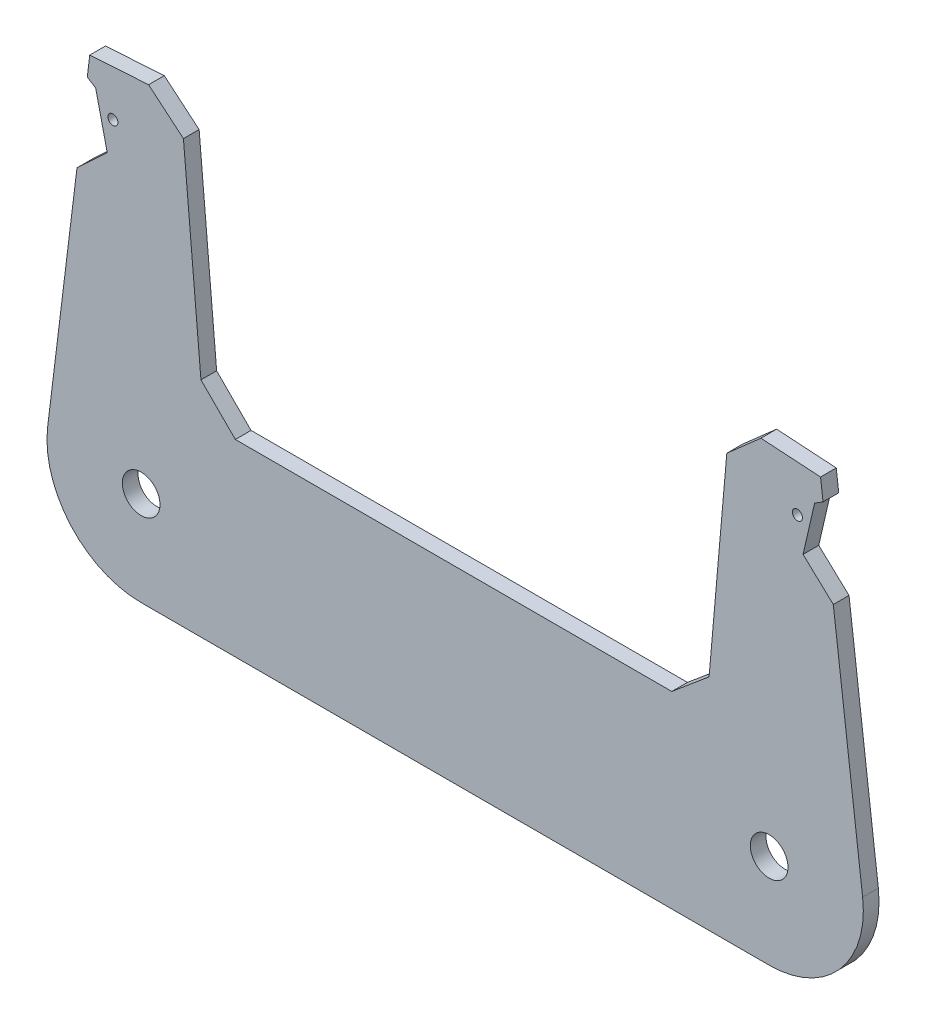
ISO-10303-21;
HEADER;
FILE_DESCRIPTION(('STEP AP214'),'2;1');
FILE_NAME('part.step','',(''),(''),'','','');
FILE_SCHEMA(('AUTOMOTIVE_DESIGN { 1 0 10303 214 1 1 1 1 }'));
ENDSEC;
DATA;
#1=APPLICATION_CONTEXT('core data for automotive mechanical design processes');
#2=APPLICATION_PROTOCOL_DEFINITION('international standard','automotive_design',2000,#1);
#3=PRODUCT_CONTEXT('',#1,'mechanical');
#4=PRODUCT('Part','Part','',(#3));
#5=PRODUCT_RELATED_PRODUCT_CATEGORY('part','',(#4));
#6=PRODUCT_DEFINITION_FORMATION('','',#4);
#7=PRODUCT_DEFINITION_CONTEXT('part definition',#1,'design');
#8=PRODUCT_DEFINITION('design','',#6,#7);
#9=PRODUCT_DEFINITION_SHAPE('','',#8);
#10=(LENGTH_UNIT() NAMED_UNIT(*) SI_UNIT(.MILLI.,.METRE.));
#11=(NAMED_UNIT(*) PLANE_ANGLE_UNIT() SI_UNIT($,.RADIAN.));
#12=(NAMED_UNIT(*) SI_UNIT($,.STERADIAN.) SOLID_ANGLE_UNIT());
#13=UNCERTAINTY_MEASURE_WITH_UNIT(LENGTH_MEASURE(1.E-05),#10,'distance_accuracy_value','');
#14=(GEOMETRIC_REPRESENTATION_CONTEXT(3) GLOBAL_UNCERTAINTY_ASSIGNED_CONTEXT((#13)) GLOBAL_UNIT_ASSIGNED_CONTEXT((#10,
#11,#12)) REPRESENTATION_CONTEXT('',''));
#15=CARTESIAN_POINT('',(0.,0.,0.));
#16=DIRECTION('',(0.,0.,1.));
#17=DIRECTION('',(1.,0.,0.));
#18=AXIS2_PLACEMENT_3D('',#15,#16,#17);
#19=CARTESIAN_POINT('',(-116.370756774674,112.8361569827,5.));
#20=DIRECTION('',(0.992546151641323,-0.121869343405144,0.));
#21=DIRECTION('',(0.121869343405144,0.992546151641323,0.));
#22=AXIS2_PLACEMENT_3D('',#19,#20,#21);
#23=PLANE('',#22);
#24=DIRECTION('',(-0.121869343405144,-0.992546151641323,0.));
#25=VECTOR('',#24,1.);
#26=CARTESIAN_POINT('',(-116.370756774674,112.8361569827,5.));
#27=LINE('',#26,#25);
#28=CARTESIAN_POINT('',(-120.438781702683,79.7047526913547,5.));
#29=VERTEX_POINT('',#28);
#30=CARTESIAN_POINT('',(-129.77638454924,3.65608030215437,5.));
#31=VERTEX_POINT('',#30);
#32=EDGE_CURVE('E246',#29,#31,#27,.T.);
#33=ORIENTED_EDGE('',*,*,#32,.F.);
#34=DIRECTION('',(0.,0.,-1.));
#35=VECTOR('',#34,1.);
#36=CARTESIAN_POINT('',(-120.438781702683,79.7047526913547,5.));
#37=LINE('',#36,#35);
#38=CARTESIAN_POINT('',(-120.438781702683,79.7047526913547,0.));
#39=VERTEX_POINT('',#38);
#40=EDGE_CURVE('E198',#29,#39,#37,.T.);
#41=ORIENTED_EDGE('',*,*,#40,.T.);
#42=DIRECTION('',(-0.121869343405144,-0.992546151641323,0.));
#43=VECTOR('',#42,1.);
#44=CARTESIAN_POINT('',(-116.370756774674,112.8361569827,0.));
#45=LINE('',#44,#43);
#46=CARTESIAN_POINT('',(-129.77638454924,3.65608030215437,0.));
#47=VERTEX_POINT('',#46);
#48=EDGE_CURVE('E217',#39,#47,#45,.T.);
#49=ORIENTED_EDGE('',*,*,#48,.T.);
#50=DIRECTION('',(0.,0.,-1.));
#51=VECTOR('',#50,1.);
#52=CARTESIAN_POINT('',(-129.77638454924,3.65608030215437,5.));
#53=LINE('',#52,#51);
#54=EDGE_CURVE('E260',#31,#47,#53,.T.);
#55=ORIENTED_EDGE('',*,*,#54,.F.);
#56=EDGE_LOOP('',(#33,#41,#49,#55));
#57=FACE_BOUND('',#56,.T.);
#58=ADVANCED_FACE('F38',(#57),#23,.F.);
#59=CARTESIAN_POINT('',(116.370756774674,112.8361569827,5.));
#60=DIRECTION('',(-0.992546151641323,-0.121869343405144,0.));
#61=DIRECTION('',(0.121869343405144,-0.992546151641323,0.));
#62=AXIS2_PLACEMENT_3D('',#59,#60,#61);
#63=PLANE('',#62);
#64=DIRECTION('',(-0.121869343405144,0.992546151641323,0.));
#65=VECTOR('',#64,1.);
#66=CARTESIAN_POINT('',(116.370756774674,112.8361569827,5.));
#67=LINE('',#66,#65);
#68=CARTESIAN_POINT('',(117.165001341998,106.367554077879,5.));
#69=VERTEX_POINT('',#68);
#70=CARTESIAN_POINT('',(116.370756774674,112.8361569827,5.));
#71=VERTEX_POINT('',#70);
#72=EDGE_CURVE('E325',#69,#71,#67,.T.);
#73=ORIENTED_EDGE('',*,*,#72,.F.);
#74=DIRECTION('',(0.,0.,-1.));
#75=VECTOR('',#74,1.);
#76=CARTESIAN_POINT('',(117.165001341998,106.367554077879,5.));
#77=LINE('',#76,#75);
#78=CARTESIAN_POINT('',(117.165001341998,106.367554077879,0.));
#79=VERTEX_POINT('',#78);
#80=EDGE_CURVE('E199',#69,#79,#77,.T.);
#81=ORIENTED_EDGE('',*,*,#80,.T.);
#82=DIRECTION('',(-0.121869343405144,0.992546151641323,0.));
#83=VECTOR('',#82,1.);
#84=CARTESIAN_POINT('',(116.370756774674,112.8361569827,0.));
#85=LINE('',#84,#83);
#86=CARTESIAN_POINT('',(116.370756774674,112.8361569827,0.));
#87=VERTEX_POINT('',#86);
#88=EDGE_CURVE('E229',#79,#87,#85,.T.);
#89=ORIENTED_EDGE('',*,*,#88,.T.);
#90=DIRECTION('',(0.,0.,-1.));
#91=VECTOR('',#90,1.);
#92=CARTESIAN_POINT('',(116.370756774674,112.8361569827,5.));
#93=LINE('',#92,#91);
#94=EDGE_CURVE('E248',#71,#87,#93,.T.);
#95=ORIENTED_EDGE('',*,*,#94,.F.);
#96=EDGE_LOOP('',(#73,#81,#89,#95));
#97=FACE_BOUND('',#96,.T.);
#98=ADVANCED_FACE('F434',(#97),#63,.F.);
#99=CARTESIAN_POINT('',(-100.,0.,5.));
#100=DIRECTION('',(0.,0.,-1.));
#101=DIRECTION('',(-1.,0.,0.));
#102=AXIS2_PLACEMENT_3D('',#99,#100,#101);
#103=PLANE('',#102);
#104=CARTESIAN_POINT('',(109.,98.6962936535525,5.));
#105=DIRECTION('',(0.,0.,-1.));
#106=DIRECTION('',(-1.,0.,0.));
#107=AXIS2_PLACEMENT_3D('',#104,#105,#106);
#108=CIRCLE('',#107,1.59999999999998);
#109=CARTESIAN_POINT('',(107.4,98.6962936535525,5.));
#110=VERTEX_POINT('',#109);
#111=EDGE_CURVE('E348',#110,#110,#108,.T.);
#112=ORIENTED_EDGE('',*,*,#111,.T.);
#113=EDGE_LOOP('',(#112));
#114=FACE_BOUND('',#113,.T.);
#115=CARTESIAN_POINT('',(-109.,98.696293653552,5.));
#116=DIRECTION('',(0.,0.,-1.));
#117=DIRECTION('',(-1.,0.,0.));
#118=AXIS2_PLACEMENT_3D('',#115,#116,#117);
#119=CIRCLE('',#118,1.60000000000001);
#120=CARTESIAN_POINT('',(-110.6,98.696293653552,5.));
#121=VERTEX_POINT('',#120);
#122=EDGE_CURVE('E354',#121,#121,#119,.T.);
#123=ORIENTED_EDGE('',*,*,#122,.T.);
#124=EDGE_LOOP('',(#123));
#125=FACE_BOUND('',#124,.T.);
#126=DIRECTION('',(-1.,0.,0.));
#127=VECTOR('',#126,1.);
#128=CARTESIAN_POINT('',(80.,30.0000000000001,5.));
#129=LINE('',#128,#127);
#130=CARTESIAN_POINT('',(68.999371323735,30.0000000000001,5.));
#131=VERTEX_POINT('',#130);
#132=CARTESIAN_POINT('',(-70.,30.0000000000001,5.));
#133=VERTEX_POINT('',#132);
#134=EDGE_CURVE('E313',#131,#133,#129,.T.);
#135=ORIENTED_EDGE('',*,*,#134,.T.);
#136=DIRECTION('',(0.707106781186543,-0.707106781186553,0.));
#137=VECTOR('',#136,1.);
#138=CARTESIAN_POINT('',(-69.9999999999998,29.9999999999998,5.));
#139=LINE('',#138,#137);
#140=CARTESIAN_POINT('',(-80.9587679629711,40.9587679629713,5.));
#141=VERTEX_POINT('',#140);
#142=EDGE_CURVE('E11',#133,#141,#139,.F.);
#143=ORIENTED_EDGE('',*,*,#142,.T.);
#144=DIRECTION('',(-0.0871557427476619,0.996194698091745,0.));
#145=VECTOR('',#144,1.);
#146=CARTESIAN_POINT('',(-87.4082381335513,114.676549337798,5.));
#147=LINE('',#146,#145);
#148=CARTESIAN_POINT('',(-86.5366807060746,104.714602356881,5.));
#149=VERTEX_POINT('',#148);
#150=EDGE_CURVE('E310',#141,#149,#147,.T.);
#151=ORIENTED_EDGE('',*,*,#150,.T.);
#152=DIRECTION('',(0.766044443118979,-0.642787609686538,0.));
#153=VECTOR('',#152,1.);
#154=CARTESIAN_POINT('',(-97.6344490404908,114.02673567318,5.));
#155=LINE('',#154,#153);
#156=CARTESIAN_POINT('',(-97.6344490404908,114.02673567318,5.));
#157=VERTEX_POINT('',#156);
#158=EDGE_CURVE('E283',#149,#157,#155,.F.);
#159=ORIENTED_EDGE('',*,*,#158,.T.);
#160=DIRECTION('',(-0.997987177795872,-0.0634160307416799,0.));
#161=VECTOR('',#160,1.);
#162=CARTESIAN_POINT('',(-116.370756774674,112.8361569827,5.));
#163=LINE('',#162,#161);
#164=CARTESIAN_POINT('',(-116.370756774674,112.8361569827,5.));
#165=VERTEX_POINT('',#164);
#166=EDGE_CURVE('E223',#157,#165,#163,.T.);
#167=ORIENTED_EDGE('',*,*,#166,.T.);
#168=CARTESIAN_POINT('',(-117.165001341998,106.367554077879,5.));
#169=VERTEX_POINT('',#168);
#170=EDGE_CURVE('E332',#165,#169,#27,.T.);
#171=ORIENTED_EDGE('',*,*,#170,.T.);
#172=DIRECTION('',(0.848048096156423,-0.529919264233209,0.));
#173=VECTOR('',#172,1.);
#174=CARTESIAN_POINT('',(-57.0189178472336,68.7841098646213,5.));
#175=LINE('',#174,#173);
#176=CARTESIAN_POINT('',(-114.490425577927,104.696293653552,5.));
#177=VERTEX_POINT('',#176);
#178=EDGE_CURVE('E193',#169,#177,#175,.T.);
#179=ORIENTED_EDGE('',*,*,#178,.T.);
#180=DIRECTION('',(0.224951054343871,-0.974370064785234,0.));
#181=VECTOR('',#180,1.);
#182=CARTESIAN_POINT('',(-90.809249751117,2.12185188504653,5.));
#183=LINE('',#182,#181);
#184=CARTESIAN_POINT('',(-110.796534519918,88.6962936535519,5.));
#185=VERTEX_POINT('',#184);
#186=EDGE_CURVE('E351',#177,#185,#183,.T.);
#187=ORIENTED_EDGE('',*,*,#186,.T.);
#188=DIRECTION('',(-0.731353701619163,-0.681998360062506,0.));
#189=VECTOR('',#188,1.);
#190=CARTESIAN_POINT('',(-149.261820141612,52.8268345187273,5.));
#191=LINE('',#190,#189);
#192=EDGE_CURVE('E357',#185,#29,#191,.T.);
#193=ORIENTED_EDGE('',*,*,#192,.T.);
#194=ORIENTED_EDGE('',*,*,#32,.T.);
#195=CARTESIAN_POINT('',(-100.,0.,5.));
#196=DIRECTION('',(0.,0.,1.));
#197=DIRECTION('',(-1.,0.,0.));
#198=AXIS2_PLACEMENT_3D('',#195,#196,#197);
#199=CIRCLE('',#198,30.);
#200=CARTESIAN_POINT('',(-100.,-30.,5.));
#201=VERTEX_POINT('',#200);
#202=EDGE_CURVE('E330',#31,#201,#199,.T.);
#203=ORIENTED_EDGE('',*,*,#202,.T.);
#204=DIRECTION('',(1.,0.,0.));
#205=VECTOR('',#204,1.);
#206=CARTESIAN_POINT('',(-100.,-30.,5.));
#207=LINE('',#206,#205);
#208=CARTESIAN_POINT('',(100.,-30.,5.));
#209=VERTEX_POINT('',#208);
#210=EDGE_CURVE('E328',#201,#209,#207,.T.);
#211=ORIENTED_EDGE('',*,*,#210,.T.);
#212=CARTESIAN_POINT('',(100.,0.,5.));
#213=DIRECTION('',(0.,0.,1.));
#214=DIRECTION('',(1.,0.,0.));
#215=AXIS2_PLACEMENT_3D('',#212,#213,#214);
#216=CIRCLE('',#215,30.);
#217=CARTESIAN_POINT('',(129.77638454924,3.65608030215436,5.));
#218=VERTEX_POINT('',#217);
#219=EDGE_CURVE('E326',#209,#218,#216,.T.);
#220=ORIENTED_EDGE('',*,*,#219,.T.);
#221=CARTESIAN_POINT('',(120.438781702683,79.7047526913547,5.));
#222=VERTEX_POINT('',#221);
#223=EDGE_CURVE('E322',#218,#222,#67,.T.);
#224=ORIENTED_EDGE('',*,*,#223,.T.);
#225=DIRECTION('',(-0.731353701619163,0.681998360062506,0.));
#226=VECTOR('',#225,1.);
#227=CARTESIAN_POINT('',(42.2861727672015,152.58323954471,5.));
#228=LINE('',#227,#226);
#229=CARTESIAN_POINT('',(110.796534519918,88.6962936535519,5.));
#230=VERTEX_POINT('',#229);
#231=EDGE_CURVE('E364',#222,#230,#228,.T.);
#232=ORIENTED_EDGE('',*,*,#231,.T.);
#233=DIRECTION('',(0.224951054343871,0.974370064785234,0.));
#234=VECTOR('',#233,1.);
#235=CARTESIAN_POINT('',(80.6886543810331,-41.7152627938624,5.));
#236=LINE('',#235,#234);
#237=CARTESIAN_POINT('',(114.490425577927,104.696293653552,5.));
#238=VERTEX_POINT('',#237);
#239=EDGE_CURVE('E343',#230,#238,#236,.T.);
#240=ORIENTED_EDGE('',*,*,#239,.T.);
#241=DIRECTION('',(0.848048096156425,0.529919264233207,0.));
#242=VECTOR('',#241,1.);
#243=CARTESIAN_POINT('',(-86.8181968316735,-21.0952947652954,5.));
#244=LINE('',#243,#242);
#245=EDGE_CURVE('E361',#238,#69,#244,.T.);
#246=ORIENTED_EDGE('',*,*,#245,.T.);
#247=ORIENTED_EDGE('',*,*,#72,.T.);
#248=DIRECTION('',(-0.997987177795872,0.0634160307416799,0.));
#249=VECTOR('',#248,1.);
#250=CARTESIAN_POINT('',(116.370756774674,112.8361569827,5.));
#251=LINE('',#250,#249);
#252=CARTESIAN_POINT('',(97.38810991151,114.042389030382,5.));
#253=VERTEX_POINT('',#252);
#254=EDGE_CURVE('E319',#71,#253,#251,.T.);
#255=ORIENTED_EDGE('',*,*,#254,.T.);
#256=DIRECTION('',(0.750525406330063,0.660841595583309,0.));
#257=VECTOR('',#256,1.);
#258=CARTESIAN_POINT('',(86.5151675341303,104.468705676359,5.));
#259=LINE('',#258,#257);
#260=CARTESIAN_POINT('',(86.5151675341303,104.468705676359,5.));
#261=VERTEX_POINT('',#260);
#262=EDGE_CURVE('E281',#253,#261,#259,.F.);
#263=ORIENTED_EDGE('',*,*,#262,.T.);
#264=DIRECTION('',(-0.0871557427476619,-0.996194698091745,0.));
#265=VECTOR('',#264,1.);
#266=CARTESIAN_POINT('',(87.4082381335513,114.676549337798,5.));
#267=LINE('',#266,#265);
#268=CARTESIAN_POINT('',(80.8715574274766,39.9619469809175,5.));
#269=VERTEX_POINT('',#268);
#270=EDGE_CURVE('E314',#261,#269,#267,.T.);
#271=ORIENTED_EDGE('',*,*,#270,.T.);
#272=DIRECTION('',(0.766044443118985,0.642787609686532,0.));
#273=VECTOR('',#272,1.);
#274=CARTESIAN_POINT('',(-44.945647061929,-65.611222901897,5.));
#275=LINE('',#274,#273);
#276=EDGE_CURVE('E301',#269,#131,#275,.F.);
#277=ORIENTED_EDGE('',*,*,#276,.T.);
#278=EDGE_LOOP('',(#135,#143,#151,#159,#167,#171,#179,#187,#193,#194,#203,#211,#220,#224,#232,
#240,#246,#247,#255,#263,#271,#277));
#279=FACE_BOUND('',#278,.T.);
#280=CARTESIAN_POINT('',(-100.,0.,5.));
#281=DIRECTION('',(0.,0.,1.));
#282=DIRECTION('',(1.,0.,0.));
#283=AXIS2_PLACEMENT_3D('',#280,#281,#282);
#284=CIRCLE('',#283,6.);
#285=CARTESIAN_POINT('',(-94.,0.,5.));
#286=VERTEX_POINT('',#285);
#287=EDGE_CURVE('E221',#286,#286,#284,.T.);
#288=ORIENTED_EDGE('',*,*,#287,.F.);
#289=EDGE_LOOP('',(#288));
#290=FACE_BOUND('',#289,.T.);
#291=CARTESIAN_POINT('',(100.,0.,5.));
#292=DIRECTION('',(0.,0.,1.));
#293=DIRECTION('',(1.,0.,0.));
#294=AXIS2_PLACEMENT_3D('',#291,#292,#293);
#295=CIRCLE('',#294,6.);
#296=CARTESIAN_POINT('',(106.,0.,5.));
#297=VERTEX_POINT('',#296);
#298=EDGE_CURVE('E337',#297,#297,#295,.T.);
#299=ORIENTED_EDGE('',*,*,#298,.F.);
#300=EDGE_LOOP('',(#299));
#301=FACE_BOUND('',#300,.T.);
#302=ADVANCED_FACE('F401',(#114,#125,#279,#290,#301),#103,.F.);
#303=CARTESIAN_POINT('',(-100.,0.,0.));
#304=DIRECTION('',(0.,0.,-1.));
#305=DIRECTION('',(-1.,0.,0.));
#306=AXIS2_PLACEMENT_3D('',#303,#304,#305);
#307=PLANE('',#306);
#308=DIRECTION('',(-0.997987177795872,-0.0634160307416799,0.));
#309=VECTOR('',#308,1.);
#310=CARTESIAN_POINT('',(-116.370756774674,112.8361569827,0.));
#311=LINE('',#310,#309);
#312=CARTESIAN_POINT('',(-97.6344490404908,114.02673567318,0.));
#313=VERTEX_POINT('',#312);
#314=CARTESIAN_POINT('',(-116.370756774674,112.8361569827,0.));
#315=VERTEX_POINT('',#314);
#316=EDGE_CURVE('E244',#313,#315,#311,.T.);
#317=ORIENTED_EDGE('',*,*,#316,.F.);
#318=DIRECTION('',(-0.766044443118979,0.642787609686538,0.));
#319=VECTOR('',#318,1.);
#320=CARTESIAN_POINT('',(-42.8754046560831,68.0784417266037,0.));
#321=LINE('',#320,#319);
#322=CARTESIAN_POINT('',(-86.5366807060746,104.714602356881,0.));
#323=VERTEX_POINT('',#322);
#324=EDGE_CURVE('E275',#313,#323,#321,.F.);
#325=ORIENTED_EDGE('',*,*,#324,.T.);
#326=DIRECTION('',(-0.0871557427476619,0.996194698091745,0.));
#327=VECTOR('',#326,1.);
#328=CARTESIAN_POINT('',(-87.4082381335513,114.676549337798,0.));
#329=LINE('',#328,#327);
#330=CARTESIAN_POINT('',(-80.9587679629711,40.9587679629713,0.));
#331=VERTEX_POINT('',#330);
#332=EDGE_CURVE('E242',#331,#323,#329,.T.);
#333=ORIENTED_EDGE('',*,*,#332,.F.);
#334=DIRECTION('',(-0.707106781186543,0.707106781186553,0.));
#335=VECTOR('',#334,1.);
#336=CARTESIAN_POINT('',(-80.9587679629711,40.9587679629713,0.));
#337=LINE('',#336,#335);
#338=CARTESIAN_POINT('',(-70.,30.0000000000001,0.));
#339=VERTEX_POINT('',#338);
#340=EDGE_CURVE('E46',#331,#339,#337,.F.);
#341=ORIENTED_EDGE('',*,*,#340,.T.);
#342=DIRECTION('',(-1.,0.,0.));
#343=VECTOR('',#342,1.);
#344=CARTESIAN_POINT('',(80.,30.0000000000001,0.));
#345=LINE('',#344,#343);
#346=CARTESIAN_POINT('',(68.999371323735,30.0000000000001,0.));
#347=VERTEX_POINT('',#346);
#348=EDGE_CURVE('E239',#347,#339,#345,.T.);
#349=ORIENTED_EDGE('',*,*,#348,.F.);
#350=DIRECTION('',(-0.766044443118985,-0.642787609686532,0.));
#351=VECTOR('',#350,1.);
#352=CARTESIAN_POINT('',(68.999371323735,30.0000000000001,0.));
#353=LINE('',#352,#351);
#354=CARTESIAN_POINT('',(80.8715574274766,39.9619469809175,0.));
#355=VERTEX_POINT('',#354);
#356=EDGE_CURVE('E299',#347,#355,#353,.F.);
#357=ORIENTED_EDGE('',*,*,#356,.T.);
#358=DIRECTION('',(-0.0871557427476619,-0.996194698091745,0.));
#359=VECTOR('',#358,1.);
#360=CARTESIAN_POINT('',(87.4082381335513,114.676549337798,0.));
#361=LINE('',#360,#359);
#362=CARTESIAN_POINT('',(86.5151675341303,104.468705676359,0.));
#363=VERTEX_POINT('',#362);
#364=EDGE_CURVE('E236',#363,#355,#361,.T.);
#365=ORIENTED_EDGE('',*,*,#364,.F.);
#366=DIRECTION('',(-0.750525406330063,-0.660841595583309,0.));
#367=VECTOR('',#366,1.);
#368=CARTESIAN_POINT('',(-70.3608822935913,-33.6614871226923,0.));
#369=LINE('',#368,#367);
#370=CARTESIAN_POINT('',(97.38810991151,114.042389030382,0.));
#371=VERTEX_POINT('',#370);
#372=EDGE_CURVE('E273',#363,#371,#369,.F.);
#373=ORIENTED_EDGE('',*,*,#372,.T.);
#374=DIRECTION('',(-0.997987177795872,0.0634160307416799,0.));
#375=VECTOR('',#374,1.);
#376=CARTESIAN_POINT('',(116.370756774674,112.8361569827,0.));
#377=LINE('',#376,#375);
#378=EDGE_CURVE('E233',#87,#371,#377,.T.);
#379=ORIENTED_EDGE('',*,*,#378,.F.);
#380=ORIENTED_EDGE('',*,*,#88,.F.);
#381=DIRECTION('',(0.848048096156424,0.529919264233207,0.));
#382=VECTOR('',#381,1.);
#383=CARTESIAN_POINT('',(114.490425577927,104.696293653552,0.));
#384=LINE('',#383,#382);
#385=CARTESIAN_POINT('',(114.490425577927,104.696293653552,0.));
#386=VERTEX_POINT('',#385);
#387=EDGE_CURVE('E381',#386,#79,#384,.T.);
#388=ORIENTED_EDGE('',*,*,#387,.F.);
#389=DIRECTION('',(0.224951054343871,0.974370064785234,0.));
#390=VECTOR('',#389,1.);
#391=CARTESIAN_POINT('',(110.796534519918,88.6962936535519,0.));
#392=LINE('',#391,#390);
#393=CARTESIAN_POINT('',(110.796534519918,88.6962936535519,0.));
#394=VERTEX_POINT('',#393);
#395=EDGE_CURVE('E374',#394,#386,#392,.T.);
#396=ORIENTED_EDGE('',*,*,#395,.F.);
#397=DIRECTION('',(-0.731353701619164,0.681998360062506,0.));
#398=VECTOR('',#397,1.);
#399=CARTESIAN_POINT('',(120.438781702683,79.7047526913547,0.));
#400=LINE('',#399,#398);
#401=CARTESIAN_POINT('',(120.438781702683,79.7047526913547,0.));
#402=VERTEX_POINT('',#401);
#403=EDGE_CURVE('E378',#402,#394,#400,.T.);
#404=ORIENTED_EDGE('',*,*,#403,.F.);
#405=CARTESIAN_POINT('',(129.77638454924,3.65608030215436,0.));
#406=VERTEX_POINT('',#405);
#407=EDGE_CURVE('E230',#406,#402,#85,.T.);
#408=ORIENTED_EDGE('',*,*,#407,.F.);
#409=CARTESIAN_POINT('',(100.,0.,0.));
#410=DIRECTION('',(0.,0.,1.));
#411=DIRECTION('',(1.,0.,0.));
#412=AXIS2_PLACEMENT_3D('',#409,#410,#411);
#413=CIRCLE('',#412,30.);
#414=CARTESIAN_POINT('',(100.,-30.,0.));
#415=VERTEX_POINT('',#414);
#416=EDGE_CURVE('E227',#415,#406,#413,.T.);
#417=ORIENTED_EDGE('',*,*,#416,.F.);
#418=DIRECTION('',(1.,0.,0.));
#419=VECTOR('',#418,1.);
#420=CARTESIAN_POINT('',(-100.,-30.,0.));
#421=LINE('',#420,#419);
#422=CARTESIAN_POINT('',(-100.,-30.,0.));
#423=VERTEX_POINT('',#422);
#424=EDGE_CURVE('E219',#423,#415,#421,.T.);
#425=ORIENTED_EDGE('',*,*,#424,.F.);
#426=CARTESIAN_POINT('',(-100.,0.,0.));
#427=DIRECTION('',(0.,0.,1.));
#428=DIRECTION('',(-1.,0.,0.));
#429=AXIS2_PLACEMENT_3D('',#426,#427,#428);
#430=CIRCLE('',#429,30.);
#431=EDGE_CURVE('E216',#47,#423,#430,.T.);
#432=ORIENTED_EDGE('',*,*,#431,.F.);
#433=ORIENTED_EDGE('',*,*,#48,.F.);
#434=DIRECTION('',(-0.731353701619164,-0.681998360062506,0.));
#435=VECTOR('',#434,1.);
#436=CARTESIAN_POINT('',(-120.438781702683,79.7047526913547,0.));
#437=LINE('',#436,#435);
#438=CARTESIAN_POINT('',(-110.796534519918,88.6962936535519,0.));
#439=VERTEX_POINT('',#438);
#440=EDGE_CURVE('E387',#439,#39,#437,.T.);
#441=ORIENTED_EDGE('',*,*,#440,.F.);
#442=DIRECTION('',(0.224951054343871,-0.974370064785234,0.));
#443=VECTOR('',#442,1.);
#444=CARTESIAN_POINT('',(-114.490425577927,104.696293653552,0.));
#445=LINE('',#444,#443);
#446=CARTESIAN_POINT('',(-114.490425577927,104.696293653552,0.));
#447=VERTEX_POINT('',#446);
#448=EDGE_CURVE('E209',#447,#439,#445,.T.);
#449=ORIENTED_EDGE('',*,*,#448,.F.);
#450=DIRECTION('',(0.848048096156423,-0.529919264233209,0.));
#451=VECTOR('',#450,1.);
#452=CARTESIAN_POINT('',(-114.490425577927,104.696293653552,0.));
#453=LINE('',#452,#451);
#454=CARTESIAN_POINT('',(-117.165001341998,106.367554077879,0.));
#455=VERTEX_POINT('',#454);
#456=EDGE_CURVE('E190',#455,#447,#453,.T.);
#457=ORIENTED_EDGE('',*,*,#456,.F.);
#458=EDGE_CURVE('E206',#315,#455,#45,.T.);
#459=ORIENTED_EDGE('',*,*,#458,.F.);
#460=EDGE_LOOP('',(#317,#325,#333,#341,#349,#357,#365,#373,#379,#380,#388,#396,#404,#408,#417,
#425,#432,#433,#441,#449,#457,#459));
#461=FACE_BOUND('',#460,.T.);
#462=CARTESIAN_POINT('',(109.,98.6962936535525,0.));
#463=DIRECTION('',(0.,0.,-1.));
#464=DIRECTION('',(1.,0.,0.));
#465=AXIS2_PLACEMENT_3D('',#462,#463,#464);
#466=CIRCLE('',#465,1.59999999999998);
#467=CARTESIAN_POINT('',(110.6,98.6962936535525,0.));
#468=VERTEX_POINT('',#467);
#469=EDGE_CURVE('E210',#468,#468,#466,.T.);
#470=ORIENTED_EDGE('',*,*,#469,.F.);
#471=EDGE_LOOP('',(#470));
#472=FACE_BOUND('',#471,.T.);
#473=CARTESIAN_POINT('',(-109.,98.696293653552,0.));
#474=DIRECTION('',(0.,0.,-1.));
#475=DIRECTION('',(-1.,0.,0.));
#476=AXIS2_PLACEMENT_3D('',#473,#474,#475);
#477=CIRCLE('',#476,1.60000000000001);
#478=CARTESIAN_POINT('',(-110.6,98.696293653552,0.));
#479=VERTEX_POINT('',#478);
#480=EDGE_CURVE('E367',#479,#479,#477,.T.);
#481=ORIENTED_EDGE('',*,*,#480,.F.);
#482=EDGE_LOOP('',(#481));
#483=FACE_BOUND('',#482,.T.);
#484=CARTESIAN_POINT('',(-100.,0.,0.));
#485=DIRECTION('',(0.,0.,1.));
#486=DIRECTION('',(1.,0.,0.));
#487=AXIS2_PLACEMENT_3D('',#484,#485,#486);
#488=CIRCLE('',#487,6.);
#489=CARTESIAN_POINT('',(-94.,0.,0.));
#490=VERTEX_POINT('',#489);
#491=EDGE_CURVE('E334',#490,#490,#488,.T.);
#492=ORIENTED_EDGE('',*,*,#491,.T.);
#493=EDGE_LOOP('',(#492));
#494=FACE_BOUND('',#493,.T.);
#495=CARTESIAN_POINT('',(100.,0.,0.));
#496=DIRECTION('',(0.,0.,1.));
#497=DIRECTION('',(1.,0.,0.));
#498=AXIS2_PLACEMENT_3D('',#495,#496,#497);
#499=CIRCLE('',#498,6.);
#500=CARTESIAN_POINT('',(106.,0.,0.));
#501=VERTEX_POINT('',#500);
#502=EDGE_CURVE('E340',#501,#501,#499,.T.);
#503=ORIENTED_EDGE('',*,*,#502,.T.);
#504=EDGE_LOOP('',(#503));
#505=FACE_BOUND('',#504,.T.);
#506=ADVANCED_FACE('F204',(#461,#472,#483,#494,#505),#307,.T.);
#507=ORIENTED_EDGE('',*,*,#458,.T.);
#508=DIRECTION('',(0.,0.,1.));
#509=VECTOR('',#508,1.);
#510=CARTESIAN_POINT('',(-117.165001341998,106.367554077879,5.));
#511=LINE('',#510,#509);
#512=EDGE_CURVE('E186',#455,#169,#511,.T.);
#513=ORIENTED_EDGE('',*,*,#512,.T.);
#514=ORIENTED_EDGE('',*,*,#170,.F.);
#515=DIRECTION('',(0.,0.,-1.));
#516=VECTOR('',#515,1.);
#517=CARTESIAN_POINT('',(-116.370756774674,112.8361569827,5.));
#518=LINE('',#517,#516);
#519=EDGE_CURVE('E215',#165,#315,#518,.T.);
#520=ORIENTED_EDGE('',*,*,#519,.T.);
#521=EDGE_LOOP('',(#507,#513,#514,#520));
#522=FACE_BOUND('',#521,.T.);
#523=ADVANCED_FACE('F213',(#522),#23,.F.);
#524=CARTESIAN_POINT('',(-100.,0.,5.));
#525=DIRECTION('',(0.,0.,-1.));
#526=DIRECTION('',(-1.,0.,0.));
#527=AXIS2_PLACEMENT_3D('',#524,#525,#526);
#528=CYLINDRICAL_SURFACE('',#527,30.);
#529=ORIENTED_EDGE('',*,*,#431,.T.);
#530=DIRECTION('',(0.,0.,-1.));
#531=VECTOR('',#530,1.);
#532=CARTESIAN_POINT('',(-100.,-30.,5.));
#533=LINE('',#532,#531);
#534=EDGE_CURVE('E257',#201,#423,#533,.T.);
#535=ORIENTED_EDGE('',*,*,#534,.F.);
#536=ORIENTED_EDGE('',*,*,#202,.F.);
#537=ORIENTED_EDGE('',*,*,#54,.T.);
#538=EDGE_LOOP('',(#529,#535,#536,#537));
#539=FACE_BOUND('',#538,.T.);
#540=ADVANCED_FACE('F405',(#539),#528,.T.);
#541=CARTESIAN_POINT('',(-100.,-30.,5.));
#542=DIRECTION('',(0.,1.,0.));
#543=DIRECTION('',(-1.,0.,0.));
#544=AXIS2_PLACEMENT_3D('',#541,#542,#543);
#545=PLANE('',#544);
#546=ORIENTED_EDGE('',*,*,#424,.T.);
#547=DIRECTION('',(0.,0.,-1.));
#548=VECTOR('',#547,1.);
#549=CARTESIAN_POINT('',(100.,-30.,5.));
#550=LINE('',#549,#548);
#551=EDGE_CURVE('E254',#209,#415,#550,.T.);
#552=ORIENTED_EDGE('',*,*,#551,.F.);
#553=ORIENTED_EDGE('',*,*,#210,.F.);
#554=ORIENTED_EDGE('',*,*,#534,.T.);
#555=EDGE_LOOP('',(#546,#552,#553,#554));
#556=FACE_BOUND('',#555,.T.);
#557=ADVANCED_FACE('F410',(#556),#545,.F.);
#558=CARTESIAN_POINT('',(100.,0.,5.));
#559=DIRECTION('',(0.,0.,-1.));
#560=DIRECTION('',(-1.,0.,0.));
#561=AXIS2_PLACEMENT_3D('',#558,#559,#560);
#562=CYLINDRICAL_SURFACE('',#561,30.);
#563=ORIENTED_EDGE('',*,*,#416,.T.);
#564=DIRECTION('',(0.,0.,-1.));
#565=VECTOR('',#564,1.);
#566=CARTESIAN_POINT('',(129.77638454924,3.65608030215436,5.));
#567=LINE('',#566,#565);
#568=EDGE_CURVE('E251',#218,#406,#567,.T.);
#569=ORIENTED_EDGE('',*,*,#568,.F.);
#570=ORIENTED_EDGE('',*,*,#219,.F.);
#571=ORIENTED_EDGE('',*,*,#551,.T.);
#572=EDGE_LOOP('',(#563,#569,#570,#571));
#573=FACE_BOUND('',#572,.T.);
#574=ADVANCED_FACE('F415',(#573),#562,.T.);
#575=ORIENTED_EDGE('',*,*,#407,.T.);
#576=DIRECTION('',(0.,0.,1.));
#577=VECTOR('',#576,1.);
#578=CARTESIAN_POINT('',(120.438781702683,79.7047526913547,5.));
#579=LINE('',#578,#577);
#580=EDGE_CURVE('E263',#402,#222,#579,.T.);
#581=ORIENTED_EDGE('',*,*,#580,.T.);
#582=ORIENTED_EDGE('',*,*,#223,.F.);
#583=ORIENTED_EDGE('',*,*,#568,.T.);
#584=EDGE_LOOP('',(#575,#581,#582,#583));
#585=FACE_BOUND('',#584,.T.);
#586=ADVANCED_FACE('F419',(#585),#63,.F.);
#587=CARTESIAN_POINT('',(116.370756774674,112.8361569827,5.));
#588=DIRECTION('',(-0.0634160307416799,-0.997987177795872,0.));
#589=DIRECTION('',(0.997987177795872,-0.0634160307416799,0.));
#590=AXIS2_PLACEMENT_3D('',#587,#588,#589);
#591=PLANE('',#590);
#592=ORIENTED_EDGE('',*,*,#378,.T.);
#593=DIRECTION('',(0.,0.,1.));
#594=VECTOR('',#593,1.);
#595=CARTESIAN_POINT('',(97.38810991151,114.042389030382,5.));
#596=LINE('',#595,#594);
#597=EDGE_CURVE('E288',#371,#253,#596,.T.);
#598=ORIENTED_EDGE('',*,*,#597,.T.);
#599=ORIENTED_EDGE('',*,*,#254,.F.);
#600=ORIENTED_EDGE('',*,*,#94,.T.);
#601=EDGE_LOOP('',(#592,#598,#599,#600));
#602=FACE_BOUND('',#601,.T.);
#603=ADVANCED_FACE('F438',(#602),#591,.F.);
#604=CARTESIAN_POINT('',(87.4082381335513,114.676549337798,5.));
#605=DIRECTION('',(0.996194698091745,-0.0871557427476619,0.));
#606=DIRECTION('',(0.0871557427476619,0.996194698091745,0.));
#607=AXIS2_PLACEMENT_3D('',#604,#605,#606);
#608=PLANE('',#607);
#609=ORIENTED_EDGE('',*,*,#364,.T.);
#610=DIRECTION('',(0.,0.,1.));
#611=VECTOR('',#610,1.);
#612=CARTESIAN_POINT('',(80.8715574274766,39.9619469809175,5.));
#613=LINE('',#612,#611);
#614=EDGE_CURVE('E295',#355,#269,#613,.T.);
#615=ORIENTED_EDGE('',*,*,#614,.T.);
#616=ORIENTED_EDGE('',*,*,#270,.F.);
#617=DIRECTION('',(0.,0.,-1.));
#618=VECTOR('',#617,1.);
#619=CARTESIAN_POINT('',(86.5151675341303,104.468705676359,5.));
#620=LINE('',#619,#618);
#621=EDGE_CURVE('E285',#261,#363,#620,.T.);
#622=ORIENTED_EDGE('',*,*,#621,.T.);
#623=EDGE_LOOP('',(#609,#615,#616,#622));
#624=FACE_BOUND('',#623,.T.);
#625=ADVANCED_FACE('F447',(#624),#608,.F.);
#626=CARTESIAN_POINT('',(80.,30.0000000000001,5.));
#627=DIRECTION('',(0.,-1.,0.));
#628=DIRECTION('',(0.,0.,-1.));
#629=AXIS2_PLACEMENT_3D('',#626,#627,#628);
#630=PLANE('',#629);
#631=ORIENTED_EDGE('',*,*,#134,.F.);
#632=DIRECTION('',(0.,0.,-1.));
#633=VECTOR('',#632,1.);
#634=CARTESIAN_POINT('',(68.999371323735,30.0000000000001,0.));
#635=LINE('',#634,#633);
#636=EDGE_CURVE('E292',#131,#347,#635,.T.);
#637=ORIENTED_EDGE('',*,*,#636,.T.);
#638=ORIENTED_EDGE('',*,*,#348,.T.);
#639=DIRECTION('',(0.,0.,1.));
#640=VECTOR('',#639,1.);
#641=CARTESIAN_POINT('',(-70.,30.0000000000001,5.));
#642=LINE('',#641,#640);
#643=EDGE_CURVE('E290',#339,#133,#642,.T.);
#644=ORIENTED_EDGE('',*,*,#643,.T.);
#645=EDGE_LOOP('',(#631,#637,#638,#644));
#646=FACE_BOUND('',#645,.T.);
#647=ADVANCED_FACE('F306',(#646),#630,.F.);
#648=CARTESIAN_POINT('',(-87.4082381335513,114.676549337798,5.));
#649=DIRECTION('',(-0.996194698091745,-0.0871557427476619,0.));
#650=DIRECTION('',(0.0871557427476619,-0.996194698091745,0.));
#651=AXIS2_PLACEMENT_3D('',#648,#649,#650);
#652=PLANE('',#651);
#653=ORIENTED_EDGE('',*,*,#150,.F.);
#654=DIRECTION('',(0.,0.,-1.));
#655=VECTOR('',#654,1.);
#656=CARTESIAN_POINT('',(-80.9587679629711,40.9587679629713,0.));
#657=LINE('',#656,#655);
#658=EDGE_CURVE('E297',#141,#331,#657,.T.);
#659=ORIENTED_EDGE('',*,*,#658,.T.);
#660=ORIENTED_EDGE('',*,*,#332,.T.);
#661=DIRECTION('',(0.,0.,1.));
#662=VECTOR('',#661,1.);
#663=CARTESIAN_POINT('',(-86.5366807060746,104.714602356881,5.));
#664=LINE('',#663,#662);
#665=EDGE_CURVE('E278',#323,#149,#664,.T.);
#666=ORIENTED_EDGE('',*,*,#665,.T.);
#667=EDGE_LOOP('',(#653,#659,#660,#666));
#668=FACE_BOUND('',#667,.T.);
#669=ADVANCED_FACE('F309',(#668),#652,.F.);
#670=CARTESIAN_POINT('',(-116.370756774674,112.8361569827,5.));
#671=DIRECTION('',(0.0634160307416799,-0.997987177795872,0.));
#672=DIRECTION('',(0.997987177795872,0.0634160307416799,0.));
#673=AXIS2_PLACEMENT_3D('',#670,#671,#672);
#674=PLANE('',#673);
#675=ORIENTED_EDGE('',*,*,#166,.F.);
#676=DIRECTION('',(0.,0.,-1.));
#677=VECTOR('',#676,1.);
#678=CARTESIAN_POINT('',(-97.6344490404908,114.02673567318,5.));
#679=LINE('',#678,#677);
#680=EDGE_CURVE('E270',#157,#313,#679,.T.);
#681=ORIENTED_EDGE('',*,*,#680,.T.);
#682=ORIENTED_EDGE('',*,*,#316,.T.);
#683=ORIENTED_EDGE('',*,*,#519,.F.);
#684=EDGE_LOOP('',(#675,#681,#682,#683));
#685=FACE_BOUND('',#684,.T.);
#686=ADVANCED_FACE('F480',(#685),#674,.F.);
#687=CARTESIAN_POINT('',(-100.,0.,5.));
#688=DIRECTION('',(0.,0.,-1.));
#689=DIRECTION('',(-1.,0.,0.));
#690=AXIS2_PLACEMENT_3D('',#687,#688,#689);
#691=CYLINDRICAL_SURFACE('',#690,6.);
#692=ORIENTED_EDGE('',*,*,#287,.T.);
#693=EDGE_LOOP('',(#692));
#694=FACE_BOUND('',#693,.T.);
#695=ORIENTED_EDGE('',*,*,#491,.F.);
#696=EDGE_LOOP('',(#695));
#697=FACE_BOUND('',#696,.T.);
#698=ADVANCED_FACE('F483',(#694,#697),#691,.F.);
#699=CARTESIAN_POINT('',(100.,0.,5.));
#700=DIRECTION('',(0.,0.,-1.));
#701=DIRECTION('',(-1.,0.,0.));
#702=AXIS2_PLACEMENT_3D('',#699,#700,#701);
#703=CYLINDRICAL_SURFACE('',#702,6.);
#704=ORIENTED_EDGE('',*,*,#298,.T.);
#705=EDGE_LOOP('',(#704));
#706=FACE_BOUND('',#705,.T.);
#707=ORIENTED_EDGE('',*,*,#502,.F.);
#708=EDGE_LOOP('',(#707));
#709=FACE_BOUND('',#708,.T.);
#710=ADVANCED_FACE('F538',(#706,#709),#703,.F.);
#711=CARTESIAN_POINT('',(110.796534519918,88.6962936535519,25.));
#712=DIRECTION('',(-0.974370064785234,0.224951054343871,0.));
#713=DIRECTION('',(-0.224951054343871,-0.974370064785234,0.));
#714=AXIS2_PLACEMENT_3D('',#711,#712,#713);
#715=PLANE('',#714);
#716=DIRECTION('',(0.,0.,-1.));
#717=VECTOR('',#716,1.);
#718=CARTESIAN_POINT('',(110.796534519918,88.6962936535519,25.));
#719=LINE('',#718,#717);
#720=EDGE_CURVE('E371',#230,#394,#719,.T.);
#721=ORIENTED_EDGE('',*,*,#720,.T.);
#722=ORIENTED_EDGE('',*,*,#395,.T.);
#723=DIRECTION('',(0.,0.,-1.));
#724=VECTOR('',#723,1.);
#725=CARTESIAN_POINT('',(114.490425577927,104.696293653552,25.));
#726=LINE('',#725,#724);
#727=EDGE_CURVE('E373',#238,#386,#726,.T.);
#728=ORIENTED_EDGE('',*,*,#727,.F.);
#729=ORIENTED_EDGE('',*,*,#239,.F.);
#730=EDGE_LOOP('',(#721,#722,#728,#729));
#731=FACE_BOUND('',#730,.T.);
#732=ADVANCED_FACE('F429',(#731),#715,.F.);
#733=CARTESIAN_POINT('',(114.490425577927,104.696293653552,25.));
#734=DIRECTION('',(-0.529919264233207,0.848048096156425,0.));
#735=DIRECTION('',(-0.848048096156425,-0.529919264233207,0.));
#736=AXIS2_PLACEMENT_3D('',#733,#734,#735);
#737=PLANE('',#736);
#738=ORIENTED_EDGE('',*,*,#727,.T.);
#739=ORIENTED_EDGE('',*,*,#387,.T.);
#740=ORIENTED_EDGE('',*,*,#80,.F.);
#741=ORIENTED_EDGE('',*,*,#245,.F.);
#742=EDGE_LOOP('',(#738,#739,#740,#741));
#743=FACE_BOUND('',#742,.T.);
#744=ADVANCED_FACE('F551',(#743),#737,.F.);
#745=CARTESIAN_POINT('',(120.438781702683,79.7047526913547,25.));
#746=DIRECTION('',(-0.681998360062506,-0.731353701619163,0.));
#747=DIRECTION('',(0.731353701619163,-0.681998360062506,0.));
#748=AXIS2_PLACEMENT_3D('',#745,#746,#747);
#749=PLANE('',#748);
#750=ORIENTED_EDGE('',*,*,#580,.F.);
#751=ORIENTED_EDGE('',*,*,#403,.T.);
#752=ORIENTED_EDGE('',*,*,#720,.F.);
#753=ORIENTED_EDGE('',*,*,#231,.F.);
#754=EDGE_LOOP('',(#750,#751,#752,#753));
#755=FACE_BOUND('',#754,.T.);
#756=ADVANCED_FACE('F422',(#755),#749,.F.);
#757=CARTESIAN_POINT('',(-114.490425577927,104.696293653552,25.));
#758=DIRECTION('',(0.974370064785234,0.224951054343871,0.));
#759=DIRECTION('',(-0.224951054343871,0.974370064785234,0.));
#760=AXIS2_PLACEMENT_3D('',#757,#758,#759);
#761=PLANE('',#760);
#762=DIRECTION('',(0.,0.,-1.));
#763=VECTOR('',#762,1.);
#764=CARTESIAN_POINT('',(-114.490425577927,104.696293653552,25.));
#765=LINE('',#764,#763);
#766=EDGE_CURVE('E385',#177,#447,#765,.T.);
#767=ORIENTED_EDGE('',*,*,#766,.T.);
#768=ORIENTED_EDGE('',*,*,#448,.T.);
#769=DIRECTION('',(0.,0.,-1.));
#770=VECTOR('',#769,1.);
#771=CARTESIAN_POINT('',(-110.796534519918,88.6962936535519,25.));
#772=LINE('',#771,#770);
#773=EDGE_CURVE('E370',#185,#439,#772,.T.);
#774=ORIENTED_EDGE('',*,*,#773,.F.);
#775=ORIENTED_EDGE('',*,*,#186,.F.);
#776=EDGE_LOOP('',(#767,#768,#774,#775));
#777=FACE_BOUND('',#776,.T.);
#778=ADVANCED_FACE('F392',(#777),#761,.F.);
#779=CARTESIAN_POINT('',(-120.438781702683,79.7047526913547,25.));
#780=DIRECTION('',(0.681998360062506,-0.731353701619163,0.));
#781=DIRECTION('',(0.731353701619163,0.681998360062506,0.));
#782=AXIS2_PLACEMENT_3D('',#779,#780,#781);
#783=PLANE('',#782);
#784=ORIENTED_EDGE('',*,*,#773,.T.);
#785=ORIENTED_EDGE('',*,*,#440,.T.);
#786=ORIENTED_EDGE('',*,*,#40,.F.);
#787=ORIENTED_EDGE('',*,*,#192,.F.);
#788=EDGE_LOOP('',(#784,#785,#786,#787));
#789=FACE_BOUND('',#788,.T.);
#790=ADVANCED_FACE('F396',(#789),#783,.F.);
#791=CARTESIAN_POINT('',(-114.490425577927,104.696293653552,25.));
#792=DIRECTION('',(0.529919264233209,0.848048096156423,0.));
#793=DIRECTION('',(-0.848048096156423,0.529919264233209,0.));
#794=AXIS2_PLACEMENT_3D('',#791,#792,#793);
#795=PLANE('',#794);
#796=ORIENTED_EDGE('',*,*,#512,.F.);
#797=ORIENTED_EDGE('',*,*,#456,.T.);
#798=ORIENTED_EDGE('',*,*,#766,.F.);
#799=ORIENTED_EDGE('',*,*,#178,.F.);
#800=EDGE_LOOP('',(#796,#797,#798,#799));
#801=FACE_BOUND('',#800,.T.);
#802=ADVANCED_FACE('F188',(#801),#795,.F.);
#803=CARTESIAN_POINT('',(-109.,98.696293653552,25.));
#804=DIRECTION('',(0.,0.,-1.));
#805=DIRECTION('',(-1.,0.,0.));
#806=AXIS2_PLACEMENT_3D('',#803,#804,#805);
#807=CYLINDRICAL_SURFACE('',#806,1.60000000000001);
#808=ORIENTED_EDGE('',*,*,#480,.T.);
#809=EDGE_LOOP('',(#808));
#810=FACE_BOUND('',#809,.T.);
#811=ORIENTED_EDGE('',*,*,#122,.F.);
#812=EDGE_LOOP('',(#811));
#813=FACE_BOUND('',#812,.T.);
#814=ADVANCED_FACE('F582',(#810,#813),#807,.F.);
#815=CARTESIAN_POINT('',(109.,98.6962936535525,25.));
#816=DIRECTION('',(0.,0.,-1.));
#817=DIRECTION('',(-1.,0.,0.));
#818=AXIS2_PLACEMENT_3D('',#815,#816,#817);
#819=CYLINDRICAL_SURFACE('',#818,1.59999999999998);
#820=ORIENTED_EDGE('',*,*,#469,.T.);
#821=EDGE_LOOP('',(#820));
#822=FACE_BOUND('',#821,.T.);
#823=ORIENTED_EDGE('',*,*,#111,.F.);
#824=EDGE_LOOP('',(#823));
#825=FACE_BOUND('',#824,.T.);
#826=ADVANCED_FACE('F589',(#822,#825),#819,.F.);
#827=CARTESIAN_POINT('',(-97.6344490404908,114.02673567318,5.));
#828=DIRECTION('',(-0.642787609686538,-0.766044443118979,0.));
#829=DIRECTION('',(0.,0.,-1.));
#830=AXIS2_PLACEMENT_3D('',#827,#828,#829);
#831=PLANE('',#830);
#832=ORIENTED_EDGE('',*,*,#158,.F.);
#833=ORIENTED_EDGE('',*,*,#665,.F.);
#834=ORIENTED_EDGE('',*,*,#324,.F.);
#835=ORIENTED_EDGE('',*,*,#680,.F.);
#836=EDGE_LOOP('',(#832,#833,#834,#835));
#837=FACE_BOUND('',#836,.T.);
#838=ADVANCED_FACE('F457',(#837),#831,.F.);
#839=CARTESIAN_POINT('',(86.5151675341303,104.468705676359,5.));
#840=DIRECTION('',(0.660841595583309,-0.750525406330063,0.));
#841=DIRECTION('',(0.,0.,-1.));
#842=AXIS2_PLACEMENT_3D('',#839,#840,#841);
#843=PLANE('',#842);
#844=ORIENTED_EDGE('',*,*,#262,.F.);
#845=ORIENTED_EDGE('',*,*,#597,.F.);
#846=ORIENTED_EDGE('',*,*,#372,.F.);
#847=ORIENTED_EDGE('',*,*,#621,.F.);
#848=EDGE_LOOP('',(#844,#845,#846,#847));
#849=FACE_BOUND('',#848,.T.);
#850=ADVANCED_FACE('F444',(#849),#843,.F.);
#851=CARTESIAN_POINT('',(68.999371323735,30.0000000000001,5.));
#852=DIRECTION('',(-0.642787609686532,0.766044443118985,0.));
#853=DIRECTION('',(0.,0.,1.));
#854=AXIS2_PLACEMENT_3D('',#851,#852,#853);
#855=PLANE('',#854);
#856=ORIENTED_EDGE('',*,*,#276,.F.);
#857=ORIENTED_EDGE('',*,*,#614,.F.);
#858=ORIENTED_EDGE('',*,*,#356,.F.);
#859=ORIENTED_EDGE('',*,*,#636,.F.);
#860=EDGE_LOOP('',(#856,#857,#858,#859));
#861=FACE_BOUND('',#860,.T.);
#862=ADVANCED_FACE('F451',(#861),#855,.T.);
#863=CARTESIAN_POINT('',(-80.9587679629711,40.9587679629713,5.));
#864=DIRECTION('',(0.707106781186553,0.707106781186543,0.));
#865=DIRECTION('',(0.,0.,1.));
#866=AXIS2_PLACEMENT_3D('',#863,#864,#865);
#867=PLANE('',#866);
#868=ORIENTED_EDGE('',*,*,#142,.F.);
#869=ORIENTED_EDGE('',*,*,#643,.F.);
#870=ORIENTED_EDGE('',*,*,#340,.F.);
#871=ORIENTED_EDGE('',*,*,#658,.F.);
#872=EDGE_LOOP('',(#868,#869,#870,#871));
#873=FACE_BOUND('',#872,.T.);
#874=ADVANCED_FACE('F40',(#873),#867,.T.);
#875=CLOSED_SHELL('',(#58,#98,#302,#506,#523,#540,#557,#574,#586,#603,#625,#647,#669,#686,#698,
#710,#732,#744,#756,#778,#790,#802,#814,#826,#838,#850,#862,#874));
#876=MANIFOLD_SOLID_BREP('B2',#875);
#877=ADVANCED_BREP_SHAPE_REPRESENTATION('',(#18,#876),#14);
#878=SHAPE_DEFINITION_REPRESENTATION(#9,#877);
ENDSEC;
END-ISO-10303-21;
